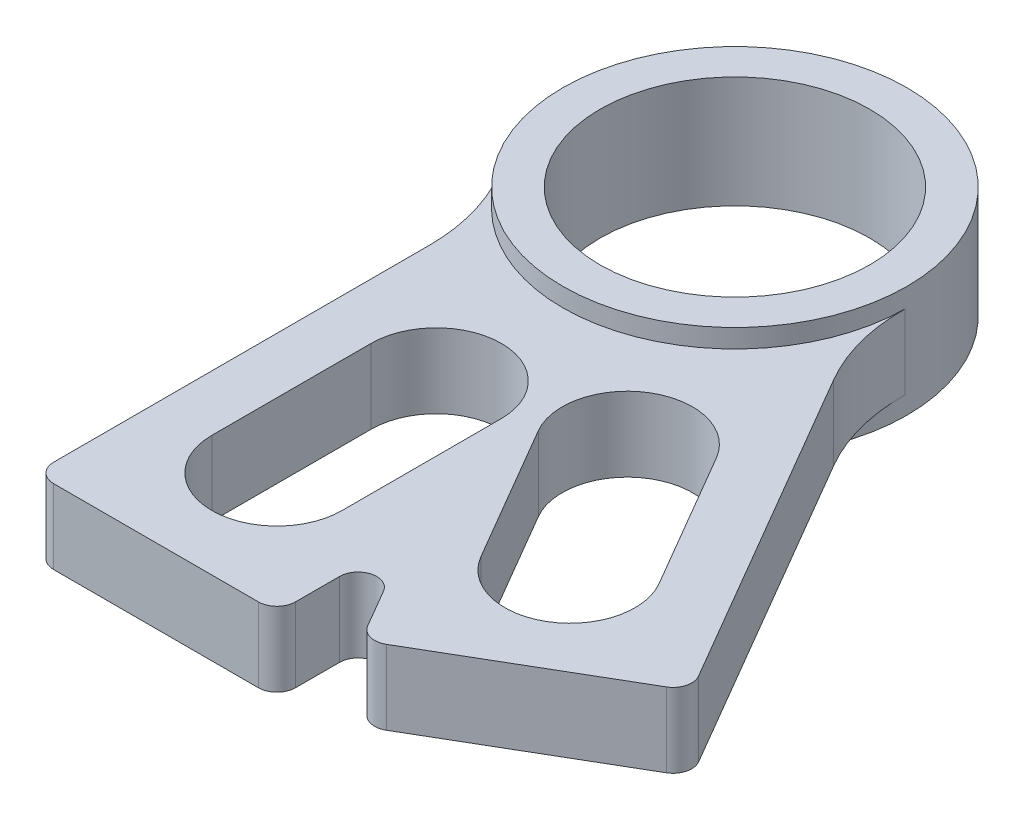
ISO-10303-21;
HEADER;
FILE_DESCRIPTION(('STEP AP214'),'2;1');
FILE_NAME('part.step','',(''),(''),'','','');
FILE_SCHEMA(('AUTOMOTIVE_DESIGN { 1 0 10303 214 1 1 1 1 }'));
ENDSEC;
DATA;
#1=APPLICATION_CONTEXT('core data for automotive mechanical design processes');
#2=APPLICATION_PROTOCOL_DEFINITION('international standard','automotive_design',2000,#1);
#3=PRODUCT_CONTEXT('',#1,'mechanical');
#4=PRODUCT('Part','Part','',(#3));
#5=PRODUCT_RELATED_PRODUCT_CATEGORY('part','',(#4));
#6=PRODUCT_DEFINITION_FORMATION('','',#4);
#7=PRODUCT_DEFINITION_CONTEXT('part definition',#1,'design');
#8=PRODUCT_DEFINITION('design','',#6,#7);
#9=PRODUCT_DEFINITION_SHAPE('','',#8);
#10=(LENGTH_UNIT() NAMED_UNIT(*) SI_UNIT(.MILLI.,.METRE.));
#11=(NAMED_UNIT(*) PLANE_ANGLE_UNIT() SI_UNIT($,.RADIAN.));
#12=(NAMED_UNIT(*) SI_UNIT($,.STERADIAN.) SOLID_ANGLE_UNIT());
#13=UNCERTAINTY_MEASURE_WITH_UNIT(LENGTH_MEASURE(1.E-05),#10,'distance_accuracy_value','');
#14=(GEOMETRIC_REPRESENTATION_CONTEXT(3) GLOBAL_UNCERTAINTY_ASSIGNED_CONTEXT((#13)) GLOBAL_UNIT_ASSIGNED_CONTEXT((#10,
#11,#12)) REPRESENTATION_CONTEXT('',''));
#15=CARTESIAN_POINT('',(0.,0.,0.));
#16=DIRECTION('',(0.,0.,1.));
#17=DIRECTION('',(1.,0.,0.));
#18=AXIS2_PLACEMENT_3D('',#15,#16,#17);
#19=CARTESIAN_POINT('',(0.,4.7625,0.));
#20=DIRECTION('',(0.,-1.,0.));
#21=DIRECTION('',(0.,0.,-1.));
#22=AXIS2_PLACEMENT_3D('',#19,#20,#21);
#23=CYLINDRICAL_SURFACE('',#22,11.5062);
#24=CARTESIAN_POINT('',(0.,4.7625,0.));
#25=DIRECTION('',(0.,1.,0.));
#26=DIRECTION('',(0.,0.,1.));
#27=AXIS2_PLACEMENT_3D('',#24,#25,#26);
#28=CIRCLE('',#27,11.5062);
#29=CARTESIAN_POINT('',(0.,4.7625,-11.5062));
#30=VERTEX_POINT('',#29);
#31=EDGE_CURVE('E299',#30,#30,#28,.T.);
#32=CARTESIAN_POINT('',(0.,-4.7625,0.));
#33=DIRECTION('',(0.,1.,0.));
#34=DIRECTION('',(0.,0.,1.));
#35=AXIS2_PLACEMENT_3D('',#32,#33,#34);
#36=CIRCLE('',#35,11.5062);
#37=CARTESIAN_POINT('',(0.,-4.7625,-11.5062));
#38=VERTEX_POINT('',#37);
#39=EDGE_CURVE('E294',#38,#38,#36,.T.);
#40=CARTESIAN_POINT('',(0.,4.7625,-11.5062));
#41=CARTESIAN_POINT('',(0.,4.66328125,-11.5062));
#42=CARTESIAN_POINT('',(0.,4.5640625,-11.5062));
#43=CARTESIAN_POINT('',(0.,4.365625,-11.5062));
#44=CARTESIAN_POINT('',(0.,4.26640625,-11.5062));
#45=CARTESIAN_POINT('',(0.,4.06796875,-11.5062));
#46=CARTESIAN_POINT('',(0.,3.96875,-11.5062));
#47=CARTESIAN_POINT('',(0.,3.7703125,-11.5062));
#48=CARTESIAN_POINT('',(0.,3.67109375,-11.5062));
#49=CARTESIAN_POINT('',(0.,3.47265625,-11.5062));
#50=CARTESIAN_POINT('',(0.,3.3734375,-11.5062));
#51=CARTESIAN_POINT('',(0.,3.175,-11.5062));
#52=CARTESIAN_POINT('',(0.,3.07578125,-11.5062));
#53=CARTESIAN_POINT('',(0.,2.87734375,-11.5062));
#54=CARTESIAN_POINT('',(0.,2.778125,-11.5062));
#55=CARTESIAN_POINT('',(0.,2.5796875,-11.5062));
#56=CARTESIAN_POINT('',(0.,2.48046875,-11.5062));
#57=CARTESIAN_POINT('',(0.,2.28203125,-11.5062));
#58=CARTESIAN_POINT('',(0.,2.1828125,-11.5062));
#59=CARTESIAN_POINT('',(0.,1.984375,-11.5062));
#60=CARTESIAN_POINT('',(0.,1.88515625,-11.5062));
#61=CARTESIAN_POINT('',(0.,1.68671875,-11.5062));
#62=CARTESIAN_POINT('',(0.,1.5875,-11.5062));
#63=CARTESIAN_POINT('',(0.,1.3890625,-11.5062));
#64=CARTESIAN_POINT('',(0.,1.28984375,-11.5062));
#65=CARTESIAN_POINT('',(0.,1.09140625,-11.5062));
#66=CARTESIAN_POINT('',(0.,0.992187499999999,-11.5062));
#67=CARTESIAN_POINT('',(0.,0.79375,-11.5062));
#68=CARTESIAN_POINT('',(0.,0.69453125,-11.5062));
#69=CARTESIAN_POINT('',(0.,0.49609375,-11.5062));
#70=CARTESIAN_POINT('',(0.,0.396875,-11.5062));
#71=CARTESIAN_POINT('',(0.,0.1984375,-11.5062));
#72=CARTESIAN_POINT('',(0.,0.0992187500000001,-11.5062));
#73=CARTESIAN_POINT('',(0.,-0.0992187500000001,-11.5062));
#74=CARTESIAN_POINT('',(0.,-0.1984375,-11.5062));
#75=CARTESIAN_POINT('',(0.,-0.396875,-11.5062));
#76=CARTESIAN_POINT('',(0.,-0.49609375,-11.5062));
#77=CARTESIAN_POINT('',(0.,-0.69453125,-11.5062));
#78=CARTESIAN_POINT('',(0.,-0.793750000000001,-11.5062));
#79=CARTESIAN_POINT('',(0.,-0.992187500000001,-11.5062));
#80=CARTESIAN_POINT('',(0.,-1.09140625,-11.5062));
#81=CARTESIAN_POINT('',(0.,-1.28984375,-11.5062));
#82=CARTESIAN_POINT('',(0.,-1.3890625,-11.5062));
#83=CARTESIAN_POINT('',(0.,-1.5875,-11.5062));
#84=CARTESIAN_POINT('',(0.,-1.68671875,-11.5062));
#85=CARTESIAN_POINT('',(0.,-1.88515625,-11.5062));
#86=CARTESIAN_POINT('',(0.,-1.984375,-11.5062));
#87=CARTESIAN_POINT('',(0.,-2.1828125,-11.5062));
#88=CARTESIAN_POINT('',(0.,-2.28203125,-11.5062));
#89=CARTESIAN_POINT('',(0.,-2.48046875,-11.5062));
#90=CARTESIAN_POINT('',(0.,-2.5796875,-11.5062));
#91=CARTESIAN_POINT('',(0.,-2.778125,-11.5062));
#92=CARTESIAN_POINT('',(0.,-2.87734375,-11.5062));
#93=CARTESIAN_POINT('',(0.,-3.07578125,-11.5062));
#94=CARTESIAN_POINT('',(0.,-3.175,-11.5062));
#95=CARTESIAN_POINT('',(0.,-3.3734375,-11.5062));
#96=CARTESIAN_POINT('',(0.,-3.47265625,-11.5062));
#97=CARTESIAN_POINT('',(0.,-3.67109375,-11.5062));
#98=CARTESIAN_POINT('',(0.,-3.7703125,-11.5062));
#99=CARTESIAN_POINT('',(0.,-3.96875,-11.5062));
#100=CARTESIAN_POINT('',(0.,-4.06796875,-11.5062));
#101=CARTESIAN_POINT('',(0.,-4.26640625,-11.5062));
#102=CARTESIAN_POINT('',(0.,-4.365625,-11.5062));
#103=CARTESIAN_POINT('',(0.,-4.5640625,-11.5062));
#104=CARTESIAN_POINT('',(0.,-4.66328125,-11.5062));
#105=CARTESIAN_POINT('',(0.,-4.7625,-11.5062));
#106=B_SPLINE_CURVE_WITH_KNOTS('',3,(#40,#41,#42,#43,#44,#45,#46,#47,#48,#49,#50,#51,#52,#53,
#54,#55,#56,#57,#58,#59,#60,#61,#62,#63,#64,#65,#66,#67,#68,#69,#70,#71,#72,#73,#74,#75,#76,#77,
#78,#79,#80,#81,#82,#83,#84,#85,#86,#87,#88,#89,#90,#91,#92,#93,#94,#95,#96,#97,#98,#99,#100,
#101,#102,#103,#104,#105),.UNSPECIFIED.,.F.,.F.,(4,2,2,2,2,2,2,2,2,2,2,2,2,2,2,2,2,2,2,2,2,2,2,
2,2,2,2,2,2,2,2,2,4),(0.,0.29765625,0.5953125,0.892968750000001,1.190625,1.48828125,1.7859375,
2.08359375,2.38125,2.67890625,2.9765625,3.27421875,3.571875,3.86953125,4.1671875,4.46484375,
4.7625,5.06015625,5.3578125,5.65546875,5.953125,6.25078125,6.5484375,6.84609375,7.14375,
7.44140625,7.7390625,8.03671875,8.334375,8.63203125,8.9296875,9.22734375,9.525),.UNSPECIFIED.);
#107=EDGE_CURVE('BSEAM41',#30,#38,#106,.T.);
#108=ORIENTED_EDGE('',*,*,#31,.T.);
#109=ORIENTED_EDGE('',*,*,#39,.F.);
#110=ORIENTED_EDGE('',*,*,#107,.T.);
#111=ORIENTED_EDGE('',*,*,#107,.F.);
#112=EDGE_LOOP('',(#108,#110,#109,#111));
#113=FACE_BOUND('',#112,.T.);
#114=ADVANCED_FACE('F41',(#113),#23,.F.);
#115=CARTESIAN_POINT('',(0.,4.7625,0.));
#116=DIRECTION('',(0.,-1.,0.));
#117=DIRECTION('',(0.,0.,-1.));
#118=AXIS2_PLACEMENT_3D('',#115,#116,#117);
#119=CYLINDRICAL_SURFACE('',#118,14.6812);
#120=DIRECTION('',(0.,-1.,0.));
#121=VECTOR('',#120,1.);
#122=CARTESIAN_POINT('',(14.6801691471723,4.7625,0.173974855687374));
#123=LINE('',#122,#121);
#124=CARTESIAN_POINT('',(14.6801691471723,3.175,0.173974855687374));
#125=VERTEX_POINT('',#124);
#126=CARTESIAN_POINT('',(14.6801691471723,-3.175,0.173974855687374));
#127=VERTEX_POINT('',#126);
#128=EDGE_CURVE('E313',#125,#127,#123,.T.);
#129=ORIENTED_EDGE('',*,*,#128,.T.);
#130=CARTESIAN_POINT('',(0.,-3.175,0.));
#131=DIRECTION('',(0.,1.,0.));
#132=DIRECTION('',(0.,0.,1.));
#133=AXIS2_PLACEMENT_3D('',#130,#131,#132);
#134=CIRCLE('',#133,14.6812);
#135=CARTESIAN_POINT('',(-12.5938687913907,-3.175,7.54533646070437));
#136=VERTEX_POINT('',#135);
#137=EDGE_CURVE('E270',#136,#127,#134,.T.);
#138=ORIENTED_EDGE('',*,*,#137,.F.);
#139=DIRECTION('',(0.,-1.,0.));
#140=VECTOR('',#139,1.);
#141=CARTESIAN_POINT('',(-12.5938687913907,4.7625,7.54533646070436));
#142=LINE('',#141,#140);
#143=CARTESIAN_POINT('',(-12.5938687913907,3.175,7.54533646070437));
#144=VERTEX_POINT('',#143);
#145=EDGE_CURVE('E306',#136,#144,#142,.F.);
#146=ORIENTED_EDGE('',*,*,#145,.T.);
#147=CARTESIAN_POINT('',(0.,3.175,0.));
#148=DIRECTION('',(0.,1.,0.));
#149=DIRECTION('',(0.,0.,1.));
#150=AXIS2_PLACEMENT_3D('',#147,#148,#149);
#151=CIRCLE('',#150,14.6812);
#152=EDGE_CURVE('E232',#144,#125,#151,.T.);
#153=ORIENTED_EDGE('',*,*,#152,.T.);
#154=EDGE_LOOP('',(#129,#138,#146,#153));
#155=FACE_BOUND('',#154,.T.);
#156=CARTESIAN_POINT('',(0.,4.7625,0.));
#157=DIRECTION('',(0.,1.,0.));
#158=DIRECTION('',(0.,0.,1.));
#159=AXIS2_PLACEMENT_3D('',#156,#157,#158);
#160=CIRCLE('',#159,14.6812);
#161=CARTESIAN_POINT('',(0.,4.7625,14.6812));
#162=VERTEX_POINT('',#161);
#163=EDGE_CURVE('E302',#162,#162,#160,.T.);
#164=ORIENTED_EDGE('',*,*,#163,.F.);
#165=EDGE_LOOP('',(#164));
#166=FACE_BOUND('',#165,.T.);
#167=CARTESIAN_POINT('',(0.,-4.7625,0.));
#168=DIRECTION('',(0.,1.,0.));
#169=DIRECTION('',(0.,0.,1.));
#170=AXIS2_PLACEMENT_3D('',#167,#168,#169);
#171=CIRCLE('',#170,14.6812);
#172=CARTESIAN_POINT('',(0.,-4.7625,14.6812));
#173=VERTEX_POINT('',#172);
#174=EDGE_CURVE('E303',#173,#173,#171,.T.);
#175=ORIENTED_EDGE('',*,*,#174,.T.);
#176=EDGE_LOOP('',(#175));
#177=FACE_BOUND('',#176,.T.);
#178=ADVANCED_FACE('F409',(#155,#166,#177),#119,.T.);
#179=CARTESIAN_POINT('',(0.,4.7625,0.));
#180=DIRECTION('',(0.,1.,0.));
#181=DIRECTION('',(0.,0.,1.));
#182=AXIS2_PLACEMENT_3D('',#179,#180,#181);
#183=PLANE('',#182);
#184=ORIENTED_EDGE('',*,*,#31,.F.);
#185=EDGE_LOOP('',(#184));
#186=FACE_BOUND('',#185,.T.);
#187=ORIENTED_EDGE('',*,*,#163,.T.);
#188=EDGE_LOOP('',(#187));
#189=FACE_BOUND('',#188,.T.);
#190=ADVANCED_FACE('F445',(#186,#189),#183,.T.);
#191=CARTESIAN_POINT('',(0.,-4.7625,0.));
#192=DIRECTION('',(0.,1.,0.));
#193=DIRECTION('',(0.,0.,1.));
#194=AXIS2_PLACEMENT_3D('',#191,#192,#193);
#195=PLANE('',#194);
#196=ORIENTED_EDGE('',*,*,#39,.T.);
#197=EDGE_LOOP('',(#196));
#198=FACE_BOUND('',#197,.T.);
#199=ORIENTED_EDGE('',*,*,#174,.F.);
#200=EDGE_LOOP('',(#199));
#201=FACE_BOUND('',#200,.T.);
#202=ADVANCED_FACE('F619',(#198,#201),#195,.F.);
#203=CARTESIAN_POINT('',(-10.31875,3.175,0.));
#204=DIRECTION('',(-1.,0.,0.));
#205=DIRECTION('',(0.,0.,1.));
#206=AXIS2_PLACEMENT_3D('',#203,#204,#205);
#207=PLANE('',#206);
#208=DIRECTION('',(0.,0.,-1.));
#209=VECTOR('',#208,1.);
#210=CARTESIAN_POINT('',(-10.31875,-3.175,0.));
#211=LINE('',#210,#209);
#212=CARTESIAN_POINT('',(-10.31875,-3.175,47.8028));
#213=VERTEX_POINT('',#212);
#214=CARTESIAN_POINT('',(-10.31875,-3.175,15.7694921185655));
#215=VERTEX_POINT('',#214);
#216=EDGE_CURVE('E272',#213,#215,#211,.T.);
#217=ORIENTED_EDGE('',*,*,#216,.F.);
#218=DIRECTION('',(0.,-1.,0.));
#219=VECTOR('',#218,1.);
#220=CARTESIAN_POINT('',(-10.31875,3.175,47.8028));
#221=LINE('',#220,#219);
#222=CARTESIAN_POINT('',(-10.31875,3.175,47.8028));
#223=VERTEX_POINT('',#222);
#224=EDGE_CURVE('E372',#213,#223,#221,.F.);
#225=ORIENTED_EDGE('',*,*,#224,.T.);
#226=DIRECTION('',(0.,0.,-1.));
#227=VECTOR('',#226,1.);
#228=CARTESIAN_POINT('',(-10.31875,3.175,0.));
#229=LINE('',#228,#227);
#230=CARTESIAN_POINT('',(-10.31875,3.175,15.7694921185655));
#231=VERTEX_POINT('',#230);
#232=EDGE_CURVE('E234',#223,#231,#229,.T.);
#233=ORIENTED_EDGE('',*,*,#232,.T.);
#234=DIRECTION('',(0.,-1.,0.));
#235=VECTOR('',#234,1.);
#236=CARTESIAN_POINT('',(-10.31875,3.175,15.7694921185655));
#237=LINE('',#236,#235);
#238=EDGE_CURVE('E319',#231,#215,#237,.T.);
#239=ORIENTED_EDGE('',*,*,#238,.T.);
#240=EDGE_LOOP('',(#217,#225,#233,#239));
#241=FACE_BOUND('',#240,.T.);
#242=ADVANCED_FACE('F611',(#241),#207,.T.);
#243=CARTESIAN_POINT('',(0.,3.175,49.3903));
#244=DIRECTION('',(0.,0.,-1.));
#245=DIRECTION('',(-1.,0.,0.));
#246=AXIS2_PLACEMENT_3D('',#243,#244,#245);
#247=PLANE('',#246);
#248=DIRECTION('',(1.,0.,0.));
#249=VECTOR('',#248,1.);
#250=CARTESIAN_POINT('',(0.,-3.175,49.3903));
#251=LINE('',#250,#249);
#252=CARTESIAN_POINT('',(-8.73124999999999,-3.175,49.3903));
#253=VERTEX_POINT('',#252);
#254=CARTESIAN_POINT('',(8.73125,-3.175,49.3903));
#255=VERTEX_POINT('',#254);
#256=EDGE_CURVE('E274',#253,#255,#251,.T.);
#257=ORIENTED_EDGE('',*,*,#256,.T.);
#258=DIRECTION('',(0.,-1.,0.));
#259=VECTOR('',#258,1.);
#260=CARTESIAN_POINT('',(8.73125,3.175,49.3903));
#261=LINE('',#260,#259);
#262=CARTESIAN_POINT('',(8.73125,3.175,49.3903));
#263=VERTEX_POINT('',#262);
#264=EDGE_CURVE('E370',#255,#263,#261,.F.);
#265=ORIENTED_EDGE('',*,*,#264,.T.);
#266=DIRECTION('',(1.,0.,0.));
#267=VECTOR('',#266,1.);
#268=CARTESIAN_POINT('',(0.,3.175,49.3903));
#269=LINE('',#268,#267);
#270=CARTESIAN_POINT('',(-8.73124999999999,3.175,49.3903));
#271=VERTEX_POINT('',#270);
#272=EDGE_CURVE('E236',#271,#263,#269,.T.);
#273=ORIENTED_EDGE('',*,*,#272,.F.);
#274=DIRECTION('',(0.,-1.,0.));
#275=VECTOR('',#274,1.);
#276=CARTESIAN_POINT('',(-8.73124999999999,-3.175,49.3903));
#277=LINE('',#276,#275);
#278=EDGE_CURVE('E367',#271,#253,#277,.T.);
#279=ORIENTED_EDGE('',*,*,#278,.T.);
#280=EDGE_LOOP('',(#257,#265,#273,#279));
#281=FACE_BOUND('',#280,.T.);
#282=ADVANCED_FACE('F426',(#281),#247,.F.);
#283=CARTESIAN_POINT('',(10.31875,3.175,0.));
#284=DIRECTION('',(-1.,0.,0.));
#285=DIRECTION('',(0.,0.,1.));
#286=AXIS2_PLACEMENT_3D('',#283,#284,#285);
#287=PLANE('',#286);
#288=DIRECTION('',(0.,0.,-1.));
#289=VECTOR('',#288,1.);
#290=CARTESIAN_POINT('',(10.31875,-3.175,0.));
#291=LINE('',#290,#289);
#292=CARTESIAN_POINT('',(10.31875,-3.175,47.8028));
#293=VERTEX_POINT('',#292);
#294=CARTESIAN_POINT('',(10.31875,-3.175,44.053125));
#295=VERTEX_POINT('',#294);
#296=EDGE_CURVE('E277',#293,#295,#291,.T.);
#297=ORIENTED_EDGE('',*,*,#296,.T.);
#298=DIRECTION('',(0.,-1.,0.));
#299=VECTOR('',#298,1.);
#300=CARTESIAN_POINT('',(10.31875,3.175,44.053125));
#301=LINE('',#300,#299);
#302=CARTESIAN_POINT('',(10.31875,3.175,44.053125));
#303=VERTEX_POINT('',#302);
#304=EDGE_CURVE('E365',#295,#303,#301,.F.);
#305=ORIENTED_EDGE('',*,*,#304,.T.);
#306=DIRECTION('',(0.,0.,-1.));
#307=VECTOR('',#306,1.);
#308=CARTESIAN_POINT('',(10.31875,3.175,0.));
#309=LINE('',#308,#307);
#310=CARTESIAN_POINT('',(10.31875,3.175,47.8028));
#311=VERTEX_POINT('',#310);
#312=EDGE_CURVE('E239',#311,#303,#309,.T.);
#313=ORIENTED_EDGE('',*,*,#312,.F.);
#314=DIRECTION('',(0.,-1.,0.));
#315=VECTOR('',#314,1.);
#316=CARTESIAN_POINT('',(10.31875,3.175,47.8028));
#317=LINE('',#316,#315);
#318=EDGE_CURVE('E362',#311,#293,#317,.T.);
#319=ORIENTED_EDGE('',*,*,#318,.T.);
#320=EDGE_LOOP('',(#297,#305,#313,#319));
#321=FACE_BOUND('',#320,.T.);
#322=ADVANCED_FACE('F381',(#321),#287,.F.);
#323=CARTESIAN_POINT('',(-8.91388274336287,3.175,5.19800884955756));
#324=DIRECTION('',(-0.863852961198093,0.,0.503744043567053));
#325=DIRECTION('',(0.503744043567053,0.,0.863852961198093));
#326=AXIS2_PLACEMENT_3D('',#323,#324,#325);
#327=PLANE('',#326);
#328=DIRECTION('',(-0.503744043567053,0.,-0.863852961198093));
#329=VECTOR('',#328,1.);
#330=CARTESIAN_POINT('',(-8.91388274336287,-3.175,5.19800884955756));
#331=LINE('',#330,#329);
#332=CARTESIAN_POINT('',(15.1664930224643,-3.175,46.4925991831178));
#333=VERTEX_POINT('',#332);
#334=CARTESIAN_POINT('',(13.277616575902,-3.175,43.2534313308373));
#335=VERTEX_POINT('',#334);
#336=EDGE_CURVE('E280',#333,#335,#331,.T.);
#337=ORIENTED_EDGE('',*,*,#336,.F.);
#338=DIRECTION('',(0.,-1.,0.));
#339=VECTOR('',#338,1.);
#340=CARTESIAN_POINT('',(15.1664930224643,3.175,46.4925991831178));
#341=LINE('',#340,#339);
#342=CARTESIAN_POINT('',(15.1664930224643,3.175,46.4925991831178));
#343=VERTEX_POINT('',#342);
#344=EDGE_CURVE('E61',#333,#343,#341,.F.);
#345=ORIENTED_EDGE('',*,*,#344,.T.);
#346=DIRECTION('',(-0.503744043567053,0.,-0.863852961198093));
#347=VECTOR('',#346,1.);
#348=CARTESIAN_POINT('',(-8.91388274336287,3.175,5.19800884955756));
#349=LINE('',#348,#347);
#350=CARTESIAN_POINT('',(13.277616575902,3.175,43.2534313308373));
#351=VERTEX_POINT('',#350);
#352=EDGE_CURVE('E241',#343,#351,#349,.T.);
#353=ORIENTED_EDGE('',*,*,#352,.T.);
#354=DIRECTION('',(0.,-1.,0.));
#355=VECTOR('',#354,1.);
#356=CARTESIAN_POINT('',(13.277616575902,3.175,43.2534313308373));
#357=LINE('',#356,#355);
#358=EDGE_CURVE('E358',#351,#335,#357,.T.);
#359=ORIENTED_EDGE('',*,*,#358,.T.);
#360=EDGE_LOOP('',(#337,#345,#353,#359));
#361=FACE_BOUND('',#360,.T.);
#362=ADVANCED_FACE('F385',(#361),#327,.T.);
#363=CARTESIAN_POINT('',(24.8800694349898,3.175,42.6659569094622));
#364=DIRECTION('',(-0.503744043567053,0.,-0.863852961198093));
#365=DIRECTION('',(-0.863852961198093,0.,0.503744043567053));
#366=AXIS2_PLACEMENT_3D('',#363,#364,#365);
#367=PLANE('',#366);
#368=DIRECTION('',(0.863852961198093,0.,-0.503744043567053));
#369=VECTOR('',#368,1.);
#370=CARTESIAN_POINT('',(24.8800694349898,-3.175,42.6659569094622));
#371=LINE('',#370,#369);
#372=CARTESIAN_POINT('',(17.337553267529,-3.175,47.0642720898571));
#373=VERTEX_POINT('',#372);
#374=CARTESIAN_POINT('',(32.4225856024507,-3.175,38.2676417290674));
#375=VERTEX_POINT('',#374);
#376=EDGE_CURVE('E283',#373,#375,#371,.T.);
#377=ORIENTED_EDGE('',*,*,#376,.T.);
#378=DIRECTION('',(0.,-1.,0.));
#379=VECTOR('',#378,1.);
#380=CARTESIAN_POINT('',(32.4225856024507,3.175,38.2676417290674));
#381=LINE('',#380,#379);
#382=CARTESIAN_POINT('',(32.4225856024507,3.175,38.2676417290674));
#383=VERTEX_POINT('',#382);
#384=EDGE_CURVE('E348',#375,#383,#381,.F.);
#385=ORIENTED_EDGE('',*,*,#384,.T.);
#386=DIRECTION('',(0.863852961198093,0.,-0.503744043567053));
#387=VECTOR('',#386,1.);
#388=CARTESIAN_POINT('',(24.8800694349898,3.175,42.6659569094622));
#389=LINE('',#388,#387);
#390=CARTESIAN_POINT('',(17.337553267529,3.175,47.0642720898571));
#391=VERTEX_POINT('',#390);
#392=EDGE_CURVE('E243',#391,#383,#389,.T.);
#393=ORIENTED_EDGE('',*,*,#392,.F.);
#394=DIRECTION('',(0.,-1.,0.));
#395=VECTOR('',#394,1.);
#396=CARTESIAN_POINT('',(17.337553267529,-3.175,47.0642720898571));
#397=LINE('',#396,#395);
#398=EDGE_CURVE('E345',#391,#373,#397,.T.);
#399=ORIENTED_EDGE('',*,*,#398,.T.);
#400=EDGE_LOOP('',(#377,#385,#393,#399));
#401=FACE_BOUND('',#400,.T.);
#402=ADVANCED_FACE('F393',(#401),#367,.F.);
#403=CARTESIAN_POINT('',(0.,3.175,25.48255));
#404=DIRECTION('',(0.,-1.,0.));
#405=DIRECTION('',(0.,0.,-1.));
#406=AXIS2_PLACEMENT_3D('',#403,#404,#405);
#407=CYLINDRICAL_SURFACE('',#406,5.55625);
#408=CARTESIAN_POINT('',(0.,-3.175,25.48255));
#409=DIRECTION('',(0.,1.,0.));
#410=DIRECTION('',(0.,0.,1.));
#411=AXIS2_PLACEMENT_3D('',#408,#409,#410);
#412=CIRCLE('',#411,5.55625);
#413=CARTESIAN_POINT('',(5.55625,-3.175,25.48255));
#414=VERTEX_POINT('',#413);
#415=CARTESIAN_POINT('',(-5.55624999999999,-3.175,25.48255));
#416=VERTEX_POINT('',#415);
#417=EDGE_CURVE('E258',#414,#416,#412,.T.);
#418=ORIENTED_EDGE('',*,*,#417,.F.);
#419=DIRECTION('',(0.,-1.,0.));
#420=VECTOR('',#419,1.);
#421=CARTESIAN_POINT('',(5.55625,3.175,25.48255));
#422=LINE('',#421,#420);
#423=CARTESIAN_POINT('',(5.55625,3.175,25.48255));
#424=VERTEX_POINT('',#423);
#425=EDGE_CURVE('E292',#424,#414,#422,.T.);
#426=ORIENTED_EDGE('',*,*,#425,.F.);
#427=CARTESIAN_POINT('',(0.,3.175,25.48255));
#428=DIRECTION('',(0.,1.,0.));
#429=DIRECTION('',(0.,0.,1.));
#430=AXIS2_PLACEMENT_3D('',#427,#428,#429);
#431=CIRCLE('',#430,5.55625);
#432=CARTESIAN_POINT('',(-5.55624999999999,3.175,25.48255));
#433=VERTEX_POINT('',#432);
#434=EDGE_CURVE('E221',#424,#433,#431,.T.);
#435=ORIENTED_EDGE('',*,*,#434,.T.);
#436=DIRECTION('',(0.,-1.,0.));
#437=VECTOR('',#436,1.);
#438=CARTESIAN_POINT('',(-5.55624999999999,3.175,25.48255));
#439=LINE('',#438,#437);
#440=EDGE_CURVE('E200',#433,#416,#439,.T.);
#441=ORIENTED_EDGE('',*,*,#440,.T.);
#442=EDGE_LOOP('',(#418,#426,#435,#441));
#443=FACE_BOUND('',#442,.T.);
#444=ADVANCED_FACE('F573',(#443),#407,.F.);
#445=CARTESIAN_POINT('',(5.55625,3.175,0.));
#446=DIRECTION('',(-1.,0.,0.));
#447=DIRECTION('',(0.,0.,1.));
#448=AXIS2_PLACEMENT_3D('',#445,#446,#447);
#449=PLANE('',#448);
#450=DIRECTION('',(0.,0.,-1.));
#451=VECTOR('',#450,1.);
#452=CARTESIAN_POINT('',(5.55625,-3.175,0.));
#453=LINE('',#452,#451);
#454=CARTESIAN_POINT('',(5.55625,-3.175,39.07155));
#455=VERTEX_POINT('',#454);
#456=EDGE_CURVE('E261',#455,#414,#453,.T.);
#457=ORIENTED_EDGE('',*,*,#456,.F.);
#458=DIRECTION('',(0.,-1.,0.));
#459=VECTOR('',#458,1.);
#460=CARTESIAN_POINT('',(5.55625,3.175,39.07155));
#461=LINE('',#460,#459);
#462=CARTESIAN_POINT('',(5.55625,3.175,39.07155));
#463=VERTEX_POINT('',#462);
#464=EDGE_CURVE('E290',#463,#455,#461,.T.);
#465=ORIENTED_EDGE('',*,*,#464,.F.);
#466=DIRECTION('',(0.,0.,-1.));
#467=VECTOR('',#466,1.);
#468=CARTESIAN_POINT('',(5.55625,3.175,0.));
#469=LINE('',#468,#467);
#470=EDGE_CURVE('E224',#463,#424,#469,.T.);
#471=ORIENTED_EDGE('',*,*,#470,.T.);
#472=ORIENTED_EDGE('',*,*,#425,.T.);
#473=EDGE_LOOP('',(#457,#465,#471,#472));
#474=FACE_BOUND('',#473,.T.);
#475=ADVANCED_FACE('F564',(#474),#449,.T.);
#476=CARTESIAN_POINT('',(0.,3.175,39.07155));
#477=DIRECTION('',(0.,-1.,0.));
#478=DIRECTION('',(0.,0.,-1.));
#479=AXIS2_PLACEMENT_3D('',#476,#477,#478);
#480=CYLINDRICAL_SURFACE('',#479,5.55625);
#481=CARTESIAN_POINT('',(0.,-3.175,39.07155));
#482=DIRECTION('',(0.,1.,0.));
#483=DIRECTION('',(0.,0.,1.));
#484=AXIS2_PLACEMENT_3D('',#481,#482,#483);
#485=CIRCLE('',#484,5.55625);
#486=CARTESIAN_POINT('',(-5.55625,-3.175,39.07155));
#487=VERTEX_POINT('',#486);
#488=EDGE_CURVE('E264',#487,#455,#485,.T.);
#489=ORIENTED_EDGE('',*,*,#488,.F.);
#490=DIRECTION('',(0.,-1.,0.));
#491=VECTOR('',#490,1.);
#492=CARTESIAN_POINT('',(-5.55625,3.175,39.07155));
#493=LINE('',#492,#491);
#494=CARTESIAN_POINT('',(-5.55625,3.175,39.07155));
#495=VERTEX_POINT('',#494);
#496=EDGE_CURVE('E288',#495,#487,#493,.T.);
#497=ORIENTED_EDGE('',*,*,#496,.F.);
#498=CARTESIAN_POINT('',(0.,3.175,39.07155));
#499=DIRECTION('',(0.,1.,0.));
#500=DIRECTION('',(0.,0.,1.));
#501=AXIS2_PLACEMENT_3D('',#498,#499,#500);
#502=CIRCLE('',#501,5.55625);
#503=EDGE_CURVE('E227',#495,#463,#502,.T.);
#504=ORIENTED_EDGE('',*,*,#503,.T.);
#505=ORIENTED_EDGE('',*,*,#464,.T.);
#506=EDGE_LOOP('',(#489,#497,#504,#505));
#507=FACE_BOUND('',#506,.T.);
#508=ADVANCED_FACE('F556',(#507),#480,.F.);
#509=CARTESIAN_POINT('',(12.8366827773996,3.175,22.0131762763785));
#510=DIRECTION('',(0.,-1.,0.));
#511=DIRECTION('',(0.,0.,-1.));
#512=AXIS2_PLACEMENT_3D('',#509,#510,#511);
#513=CYLINDRICAL_SURFACE('',#512,5.55625000000001);
#514=CARTESIAN_POINT('',(12.8366827773996,-3.175,22.0131762763785));
#515=DIRECTION('',(0.,1.,0.));
#516=DIRECTION('',(0.,0.,1.));
#517=AXIS2_PLACEMENT_3D('',#514,#515,#516);
#518=CIRCLE('',#517,5.55625000000001);
#519=CARTESIAN_POINT('',(17.6364657930565,-3.175,19.2142484343091));
#520=VERTEX_POINT('',#519);
#521=CARTESIAN_POINT('',(8.03689976174268,-3.175,24.812104118448));
#522=VERTEX_POINT('',#521);
#523=EDGE_CURVE('E195',#520,#522,#518,.T.);
#524=ORIENTED_EDGE('',*,*,#523,.F.);
#525=DIRECTION('',(0.,-1.,0.));
#526=VECTOR('',#525,1.);
#527=CARTESIAN_POINT('',(17.6364657930565,3.175,19.2142484343091));
#528=LINE('',#527,#526);
#529=CARTESIAN_POINT('',(17.6364657930565,3.175,19.2142484343091));
#530=VERTEX_POINT('',#529);
#531=EDGE_CURVE('E190',#530,#520,#528,.T.);
#532=ORIENTED_EDGE('',*,*,#531,.F.);
#533=CARTESIAN_POINT('',(12.8366827773996,3.175,22.0131762763785));
#534=DIRECTION('',(0.,1.,0.));
#535=DIRECTION('',(0.,0.,1.));
#536=AXIS2_PLACEMENT_3D('',#533,#534,#535);
#537=CIRCLE('',#536,5.55625000000001);
#538=CARTESIAN_POINT('',(8.03689976174268,3.175,24.812104118448));
#539=VERTEX_POINT('',#538);
#540=EDGE_CURVE('E193',#530,#539,#537,.T.);
#541=ORIENTED_EDGE('',*,*,#540,.T.);
#542=DIRECTION('',(0.,-1.,0.));
#543=VECTOR('',#542,1.);
#544=CARTESIAN_POINT('',(8.03689976174268,3.175,24.812104118448));
#545=LINE('',#544,#543);
#546=EDGE_CURVE('E248',#539,#522,#545,.T.);
#547=ORIENTED_EDGE('',*,*,#546,.T.);
#548=EDGE_LOOP('',(#524,#532,#541,#547));
#549=FACE_BOUND('',#548,.T.);
#550=ADVANCED_FACE('F192',(#549),#513,.F.);
#551=CARTESIAN_POINT('',(4.79978301565689,3.175,-2.79892784206943));
#552=DIRECTION('',(-0.863852961198094,0.,0.503744043567053));
#553=DIRECTION('',(0.503744043567053,0.,0.863852961198094));
#554=AXIS2_PLACEMENT_3D('',#551,#552,#553);
#555=PLANE('',#554);
#556=DIRECTION('',(-0.503744043567053,0.,-0.863852961198094));
#557=VECTOR('',#556,1.);
#558=CARTESIAN_POINT('',(4.79978301565689,-3.175,-2.79892784206943));
#559=LINE('',#558,#557);
#560=CARTESIAN_POINT('',(24.4818436010892,-3.175,30.95314632403));
#561=VERTEX_POINT('',#560);
#562=EDGE_CURVE('E250',#561,#520,#559,.T.);
#563=ORIENTED_EDGE('',*,*,#562,.F.);
#564=DIRECTION('',(0.,-1.,0.));
#565=VECTOR('',#564,1.);
#566=CARTESIAN_POINT('',(24.4818436010892,3.175,30.95314632403));
#567=LINE('',#566,#565);
#568=CARTESIAN_POINT('',(24.4818436010892,3.175,30.95314632403));
#569=VERTEX_POINT('',#568);
#570=EDGE_CURVE('E201',#569,#561,#567,.T.);
#571=ORIENTED_EDGE('',*,*,#570,.F.);
#572=DIRECTION('',(-0.503744043567053,0.,-0.863852961198094));
#573=VECTOR('',#572,1.);
#574=CARTESIAN_POINT('',(4.79978301565689,3.175,-2.79892784206943));
#575=LINE('',#574,#573);
#576=EDGE_CURVE('E208',#569,#530,#575,.T.);
#577=ORIENTED_EDGE('',*,*,#576,.T.);
#578=ORIENTED_EDGE('',*,*,#531,.T.);
#579=EDGE_LOOP('',(#563,#571,#577,#578));
#580=FACE_BOUND('',#579,.T.);
#581=ADVANCED_FACE('F215',(#580),#555,.T.);
#582=CARTESIAN_POINT('',(19.6820605854323,3.175,33.7520741660994));
#583=DIRECTION('',(0.,-1.,0.));
#584=DIRECTION('',(0.,0.,-1.));
#585=AXIS2_PLACEMENT_3D('',#582,#583,#584);
#586=CYLINDRICAL_SURFACE('',#585,5.55625);
#587=CARTESIAN_POINT('',(19.6820605854323,-3.175,33.7520741660994));
#588=DIRECTION('',(0.,1.,0.));
#589=DIRECTION('',(0.,0.,1.));
#590=AXIS2_PLACEMENT_3D('',#587,#588,#589);
#591=CIRCLE('',#590,5.55625);
#592=CARTESIAN_POINT('',(14.8822775697754,-3.175,36.5510020081689));
#593=VERTEX_POINT('',#592);
#594=EDGE_CURVE('E252',#593,#561,#591,.T.);
#595=ORIENTED_EDGE('',*,*,#594,.F.);
#596=DIRECTION('',(0.,-1.,0.));
#597=VECTOR('',#596,1.);
#598=CARTESIAN_POINT('',(14.8822775697754,3.175,36.5510020081689));
#599=LINE('',#598,#597);
#600=CARTESIAN_POINT('',(14.8822775697754,3.175,36.5510020081689));
#601=VERTEX_POINT('',#600);
#602=EDGE_CURVE('E296',#601,#593,#599,.T.);
#603=ORIENTED_EDGE('',*,*,#602,.F.);
#604=CARTESIAN_POINT('',(19.6820605854323,3.175,33.7520741660994));
#605=DIRECTION('',(0.,1.,0.));
#606=DIRECTION('',(0.,0.,1.));
#607=AXIS2_PLACEMENT_3D('',#604,#605,#606);
#608=CIRCLE('',#607,5.55625);
#609=EDGE_CURVE('E216',#601,#569,#608,.T.);
#610=ORIENTED_EDGE('',*,*,#609,.T.);
#611=ORIENTED_EDGE('',*,*,#570,.T.);
#612=EDGE_LOOP('',(#595,#603,#610,#611));
#613=FACE_BOUND('',#612,.T.);
#614=ADVANCED_FACE('F532',(#613),#586,.F.);
#615=CARTESIAN_POINT('',(-5.55624999999999,3.175,0.));
#616=DIRECTION('',(-1.,0.,0.));
#617=DIRECTION('',(0.,0.,1.));
#618=AXIS2_PLACEMENT_3D('',#615,#616,#617);
#619=PLANE('',#618);
#620=DIRECTION('',(0.,0.,-1.));
#621=VECTOR('',#620,1.);
#622=CARTESIAN_POINT('',(-5.55624999999999,-3.175,0.));
#623=LINE('',#622,#621);
#624=EDGE_CURVE('E267',#487,#416,#623,.T.);
#625=ORIENTED_EDGE('',*,*,#624,.T.);
#626=ORIENTED_EDGE('',*,*,#440,.F.);
#627=DIRECTION('',(0.,0.,-1.));
#628=VECTOR('',#627,1.);
#629=CARTESIAN_POINT('',(-5.55624999999999,3.175,0.));
#630=LINE('',#629,#628);
#631=EDGE_CURVE('E230',#495,#433,#630,.T.);
#632=ORIENTED_EDGE('',*,*,#631,.F.);
#633=ORIENTED_EDGE('',*,*,#496,.T.);
#634=EDGE_LOOP('',(#625,#626,#632,#633));
#635=FACE_BOUND('',#634,.T.);
#636=ADVANCED_FACE('F523',(#635),#619,.F.);
#637=CARTESIAN_POINT('',(-4.79978301565695,3.175,2.79892784206947));
#638=DIRECTION('',(-0.863852961198093,0.,0.503744043567054));
#639=DIRECTION('',(0.503744043567054,0.,0.863852961198093));
#640=AXIS2_PLACEMENT_3D('',#637,#638,#639);
#641=PLANE('',#640);
#642=DIRECTION('',(-0.503744043567054,0.,-0.863852961198093));
#643=VECTOR('',#642,1.);
#644=CARTESIAN_POINT('',(-4.79978301565695,-3.175,2.79892784206947));
#645=LINE('',#644,#643);
#646=EDGE_CURVE('E255',#593,#522,#645,.T.);
#647=ORIENTED_EDGE('',*,*,#646,.T.);
#648=ORIENTED_EDGE('',*,*,#546,.F.);
#649=DIRECTION('',(-0.503744043567054,0.,-0.863852961198093));
#650=VECTOR('',#649,1.);
#651=CARTESIAN_POINT('',(-4.79978301565695,3.175,2.79892784206947));
#652=LINE('',#651,#650);
#653=EDGE_CURVE('E211',#601,#539,#652,.T.);
#654=ORIENTED_EDGE('',*,*,#653,.F.);
#655=ORIENTED_EDGE('',*,*,#602,.T.);
#656=EDGE_LOOP('',(#647,#648,#654,#655));
#657=FACE_BOUND('',#656,.T.);
#658=ADVANCED_FACE('F515',(#657),#641,.F.);
#659=CARTESIAN_POINT('',(8.91388274336278,3.175,-5.19800884955751));
#660=DIRECTION('',(-0.863852961198093,0.,0.503744043567053));
#661=DIRECTION('',(0.503744043567054,0.,0.863852961198093));
#662=AXIS2_PLACEMENT_3D('',#659,#660,#661);
#663=PLANE('',#662);
#664=DIRECTION('',(-0.503744043567054,0.,-0.863852961198093));
#665=VECTOR('',#664,1.);
#666=CARTESIAN_POINT('',(8.91388274336278,3.175,-5.19800884955751));
#667=LINE('',#666,#665);
#668=CARTESIAN_POINT('',(32.9942585091899,3.175,36.0965814840027));
#669=VERTEX_POINT('',#668);
#670=CARTESIAN_POINT('',(16.8576704681678,3.175,8.4245136136554));
#671=VERTEX_POINT('',#670);
#672=EDGE_CURVE('E246',#669,#671,#667,.T.);
#673=ORIENTED_EDGE('',*,*,#672,.F.);
#674=DIRECTION('',(0.,-1.,0.));
#675=VECTOR('',#674,1.);
#676=CARTESIAN_POINT('',(32.9942585091899,3.175,36.0965814840027));
#677=LINE('',#676,#675);
#678=CARTESIAN_POINT('',(32.9942585091899,-3.175,36.0965814840027));
#679=VERTEX_POINT('',#678);
#680=EDGE_CURVE('E334',#669,#679,#677,.T.);
#681=ORIENTED_EDGE('',*,*,#680,.T.);
#682=DIRECTION('',(-0.503744043567054,0.,-0.863852961198093));
#683=VECTOR('',#682,1.);
#684=CARTESIAN_POINT('',(8.91388274336278,-3.175,-5.19800884955751));
#685=LINE('',#684,#683);
#686=CARTESIAN_POINT('',(16.8576704681678,-3.175,8.4245136136554));
#687=VERTEX_POINT('',#686);
#688=EDGE_CURVE('E213',#679,#687,#685,.T.);
#689=ORIENTED_EDGE('',*,*,#688,.T.);
#690=DIRECTION('',(0.,1.,0.));
#691=VECTOR('',#690,1.);
#692=CARTESIAN_POINT('',(16.8576704681678,3.175,8.4245136136554));
#693=LINE('',#692,#691);
#694=EDGE_CURVE('E316',#687,#671,#693,.T.);
#695=ORIENTED_EDGE('',*,*,#694,.T.);
#696=EDGE_LOOP('',(#673,#681,#689,#695));
#697=FACE_BOUND('',#696,.T.);
#698=ADVANCED_FACE('F401',(#697),#663,.F.);
#699=CARTESIAN_POINT('',(0.,3.175,0.));
#700=DIRECTION('',(0.,1.,0.));
#701=DIRECTION('',(0.,0.,1.));
#702=AXIS2_PLACEMENT_3D('',#699,#700,#701);
#703=PLANE('',#702);
#704=ORIENTED_EDGE('',*,*,#540,.F.);
#705=ORIENTED_EDGE('',*,*,#576,.F.);
#706=ORIENTED_EDGE('',*,*,#609,.F.);
#707=ORIENTED_EDGE('',*,*,#653,.T.);
#708=EDGE_LOOP('',(#704,#705,#706,#707));
#709=FACE_BOUND('',#708,.T.);
#710=ORIENTED_EDGE('',*,*,#434,.F.);
#711=ORIENTED_EDGE('',*,*,#470,.F.);
#712=ORIENTED_EDGE('',*,*,#503,.F.);
#713=ORIENTED_EDGE('',*,*,#631,.T.);
#714=EDGE_LOOP('',(#710,#711,#712,#713));
#715=FACE_BOUND('',#714,.T.);
#716=ORIENTED_EDGE('',*,*,#392,.T.);
#717=CARTESIAN_POINT('',(31.622891933288,3.175,36.8962751531654));
#718=DIRECTION('',(0.,1.,0.));
#719=DIRECTION('',(0.,0.,1.));
#720=AXIS2_PLACEMENT_3D('',#717,#718,#719);
#721=CIRCLE('',#720,1.5875);
#722=EDGE_CURVE('E356',#383,#669,#721,.T.);
#723=ORIENTED_EDGE('',*,*,#722,.T.);
#724=ORIENTED_EDGE('',*,*,#672,.T.);
#725=CARTESIAN_POINT('',(30.6810455532597,3.175,0.363601428495411));
#726=DIRECTION('',(0.,1.,0.));
#727=DIRECTION('',(0.,0.,1.));
#728=AXIS2_PLACEMENT_3D('',#725,#726,#727);
#729=CIRCLE('',#728,16.002);
#730=EDGE_CURVE('E325',#671,#125,#729,.F.);
#731=ORIENTED_EDGE('',*,*,#730,.T.);
#732=ORIENTED_EDGE('',*,*,#152,.F.);
#733=CARTESIAN_POINT('',(-26.32075,3.175,15.7694921185655));
#734=DIRECTION('',(0.,1.,0.));
#735=DIRECTION('',(0.,0.,1.));
#736=AXIS2_PLACEMENT_3D('',#733,#734,#735);
#737=CIRCLE('',#736,16.002);
#738=EDGE_CURVE('E331',#144,#231,#737,.F.);
#739=ORIENTED_EDGE('',*,*,#738,.T.);
#740=ORIENTED_EDGE('',*,*,#232,.F.);
#741=CARTESIAN_POINT('',(-8.73124999999999,3.175,47.8028));
#742=DIRECTION('',(0.,1.,0.));
#743=DIRECTION('',(0.,0.,1.));
#744=AXIS2_PLACEMENT_3D('',#741,#742,#743);
#745=CIRCLE('',#744,1.5875);
#746=EDGE_CURVE('E350',#223,#271,#745,.T.);
#747=ORIENTED_EDGE('',*,*,#746,.T.);
#748=ORIENTED_EDGE('',*,*,#272,.T.);
#749=CARTESIAN_POINT('',(8.73125,3.175,47.8028));
#750=DIRECTION('',(0.,1.,0.));
#751=DIRECTION('',(0.,0.,1.));
#752=AXIS2_PLACEMENT_3D('',#749,#750,#751);
#753=CIRCLE('',#752,1.5875);
#754=EDGE_CURVE('E352',#263,#311,#753,.T.);
#755=ORIENTED_EDGE('',*,*,#754,.T.);
#756=ORIENTED_EDGE('',*,*,#312,.T.);
#757=CARTESIAN_POINT('',(11.90625,3.175,44.053125));
#758=DIRECTION('',(0.,1.,0.));
#759=DIRECTION('',(0.,0.,1.));
#760=AXIS2_PLACEMENT_3D('',#757,#758,#759);
#761=CIRCLE('',#760,1.5875);
#762=EDGE_CURVE('E11',#303,#351,#761,.F.);
#763=ORIENTED_EDGE('',*,*,#762,.T.);
#764=ORIENTED_EDGE('',*,*,#352,.F.);
#765=CARTESIAN_POINT('',(16.5378595983663,3.175,45.6929055139551));
#766=DIRECTION('',(0.,1.,0.));
#767=DIRECTION('',(0.,0.,1.));
#768=AXIS2_PLACEMENT_3D('',#765,#766,#767);
#769=CIRCLE('',#768,1.5875);
#770=EDGE_CURVE('E354',#343,#391,#769,.T.);
#771=ORIENTED_EDGE('',*,*,#770,.T.);
#772=EDGE_LOOP('',(#716,#723,#724,#731,#732,#739,#740,#747,#748,#755,#756,#763,#764,#771));
#773=FACE_BOUND('',#772,.T.);
#774=ADVANCED_FACE('F205',(#709,#715,#773),#703,.T.);
#775=CARTESIAN_POINT('',(0.,-3.175,0.));
#776=DIRECTION('',(0.,1.,0.));
#777=DIRECTION('',(0.,0.,1.));
#778=AXIS2_PLACEMENT_3D('',#775,#776,#777);
#779=PLANE('',#778);
#780=ORIENTED_EDGE('',*,*,#523,.T.);
#781=ORIENTED_EDGE('',*,*,#646,.F.);
#782=ORIENTED_EDGE('',*,*,#594,.T.);
#783=ORIENTED_EDGE('',*,*,#562,.T.);
#784=EDGE_LOOP('',(#780,#781,#782,#783));
#785=FACE_BOUND('',#784,.T.);
#786=ORIENTED_EDGE('',*,*,#417,.T.);
#787=ORIENTED_EDGE('',*,*,#624,.F.);
#788=ORIENTED_EDGE('',*,*,#488,.T.);
#789=ORIENTED_EDGE('',*,*,#456,.T.);
#790=EDGE_LOOP('',(#786,#787,#788,#789));
#791=FACE_BOUND('',#790,.T.);
#792=ORIENTED_EDGE('',*,*,#688,.F.);
#793=CARTESIAN_POINT('',(31.622891933288,-3.175,36.8962751531654));
#794=DIRECTION('',(0.,1.,0.));
#795=DIRECTION('',(0.,0.,1.));
#796=AXIS2_PLACEMENT_3D('',#793,#794,#795);
#797=CIRCLE('',#796,1.5875);
#798=EDGE_CURVE('E343',#679,#375,#797,.F.);
#799=ORIENTED_EDGE('',*,*,#798,.T.);
#800=ORIENTED_EDGE('',*,*,#376,.F.);
#801=CARTESIAN_POINT('',(16.5378595983663,-3.175,45.6929055139551));
#802=DIRECTION('',(0.,1.,0.));
#803=DIRECTION('',(0.,0.,1.));
#804=AXIS2_PLACEMENT_3D('',#801,#802,#803);
#805=CIRCLE('',#804,1.5875);
#806=EDGE_CURVE('E341',#373,#333,#805,.F.);
#807=ORIENTED_EDGE('',*,*,#806,.T.);
#808=ORIENTED_EDGE('',*,*,#336,.T.);
#809=CARTESIAN_POINT('',(11.90625,-3.175,44.053125));
#810=DIRECTION('',(0.,1.,0.));
#811=DIRECTION('',(0.,0.,1.));
#812=AXIS2_PLACEMENT_3D('',#809,#810,#811);
#813=CIRCLE('',#812,1.5875);
#814=EDGE_CURVE('E49',#335,#295,#813,.T.);
#815=ORIENTED_EDGE('',*,*,#814,.T.);
#816=ORIENTED_EDGE('',*,*,#296,.F.);
#817=CARTESIAN_POINT('',(8.73125,-3.175,47.8028));
#818=DIRECTION('',(0.,1.,0.));
#819=DIRECTION('',(0.,0.,1.));
#820=AXIS2_PLACEMENT_3D('',#817,#818,#819);
#821=CIRCLE('',#820,1.5875);
#822=EDGE_CURVE('E339',#293,#255,#821,.F.);
#823=ORIENTED_EDGE('',*,*,#822,.T.);
#824=ORIENTED_EDGE('',*,*,#256,.F.);
#825=CARTESIAN_POINT('',(-8.73124999999999,-3.175,47.8028));
#826=DIRECTION('',(0.,1.,0.));
#827=DIRECTION('',(0.,0.,1.));
#828=AXIS2_PLACEMENT_3D('',#825,#826,#827);
#829=CIRCLE('',#828,1.5875);
#830=EDGE_CURVE('E337',#253,#213,#829,.F.);
#831=ORIENTED_EDGE('',*,*,#830,.T.);
#832=ORIENTED_EDGE('',*,*,#216,.T.);
#833=CARTESIAN_POINT('',(-26.32075,-3.175,15.7694921185655));
#834=DIRECTION('',(0.,1.,0.));
#835=DIRECTION('',(0.,0.,1.));
#836=AXIS2_PLACEMENT_3D('',#833,#834,#835);
#837=CIRCLE('',#836,16.002);
#838=EDGE_CURVE('E328',#215,#136,#837,.T.);
#839=ORIENTED_EDGE('',*,*,#838,.T.);
#840=ORIENTED_EDGE('',*,*,#137,.T.);
#841=CARTESIAN_POINT('',(30.6810455532597,-3.175,0.363601428495411));
#842=DIRECTION('',(0.,1.,0.));
#843=DIRECTION('',(0.,0.,1.));
#844=AXIS2_PLACEMENT_3D('',#841,#842,#843);
#845=CIRCLE('',#844,16.002);
#846=EDGE_CURVE('E322',#127,#687,#845,.T.);
#847=ORIENTED_EDGE('',*,*,#846,.T.);
#848=EDGE_LOOP('',(#792,#799,#800,#807,#808,#815,#816,#823,#824,#831,#832,#839,#840,#847));
#849=FACE_BOUND('',#848,.T.);
#850=ADVANCED_FACE('F376',(#785,#791,#849),#779,.F.);
#851=CARTESIAN_POINT('',(30.6810455532597,4.7625,0.363601428495411));
#852=DIRECTION('',(0.,-1.,0.));
#853=DIRECTION('',(0.,0.,-1.));
#854=AXIS2_PLACEMENT_3D('',#851,#852,#853);
#855=CYLINDRICAL_SURFACE('',#854,16.002);
#856=ORIENTED_EDGE('',*,*,#730,.F.);
#857=ORIENTED_EDGE('',*,*,#694,.F.);
#858=ORIENTED_EDGE('',*,*,#846,.F.);
#859=ORIENTED_EDGE('',*,*,#128,.F.);
#860=EDGE_LOOP('',(#856,#857,#858,#859));
#861=FACE_BOUND('',#860,.T.);
#862=ADVANCED_FACE('F407',(#861),#855,.F.);
#863=CARTESIAN_POINT('',(-26.32075,4.7625,15.7694921185655));
#864=DIRECTION('',(0.,-1.,0.));
#865=DIRECTION('',(0.,0.,-1.));
#866=AXIS2_PLACEMENT_3D('',#863,#864,#865);
#867=CYLINDRICAL_SURFACE('',#866,16.002);
#868=ORIENTED_EDGE('',*,*,#738,.F.);
#869=ORIENTED_EDGE('',*,*,#145,.F.);
#870=ORIENTED_EDGE('',*,*,#838,.F.);
#871=ORIENTED_EDGE('',*,*,#238,.F.);
#872=EDGE_LOOP('',(#868,#869,#870,#871));
#873=FACE_BOUND('',#872,.T.);
#874=ADVANCED_FACE('F416',(#873),#867,.F.);
#875=CARTESIAN_POINT('',(31.622891933288,3.175,36.8962751531654));
#876=DIRECTION('',(0.,-1.,0.));
#877=DIRECTION('',(0.,0.,-1.));
#878=AXIS2_PLACEMENT_3D('',#875,#876,#877);
#879=CYLINDRICAL_SURFACE('',#878,1.5875);
#880=ORIENTED_EDGE('',*,*,#722,.F.);
#881=ORIENTED_EDGE('',*,*,#384,.F.);
#882=ORIENTED_EDGE('',*,*,#798,.F.);
#883=ORIENTED_EDGE('',*,*,#680,.F.);
#884=EDGE_LOOP('',(#880,#881,#882,#883));
#885=FACE_BOUND('',#884,.T.);
#886=ADVANCED_FACE('F398',(#885),#879,.T.);
#887=CARTESIAN_POINT('',(16.5378595983663,3.175,45.6929055139551));
#888=DIRECTION('',(0.,1.,0.));
#889=DIRECTION('',(0.,0.,1.));
#890=AXIS2_PLACEMENT_3D('',#887,#888,#889);
#891=CYLINDRICAL_SURFACE('',#890,1.5875);
#892=ORIENTED_EDGE('',*,*,#770,.F.);
#893=ORIENTED_EDGE('',*,*,#344,.F.);
#894=ORIENTED_EDGE('',*,*,#806,.F.);
#895=ORIENTED_EDGE('',*,*,#398,.F.);
#896=EDGE_LOOP('',(#892,#893,#894,#895));
#897=FACE_BOUND('',#896,.T.);
#898=ADVANCED_FACE('F390',(#897),#891,.T.);
#899=CARTESIAN_POINT('',(11.90625,3.175,44.053125));
#900=DIRECTION('',(0.,-1.,0.));
#901=DIRECTION('',(0.,0.,-1.));
#902=AXIS2_PLACEMENT_3D('',#899,#900,#901);
#903=CYLINDRICAL_SURFACE('',#902,1.5875);
#904=ORIENTED_EDGE('',*,*,#762,.F.);
#905=ORIENTED_EDGE('',*,*,#304,.F.);
#906=ORIENTED_EDGE('',*,*,#814,.F.);
#907=ORIENTED_EDGE('',*,*,#358,.F.);
#908=EDGE_LOOP('',(#904,#905,#906,#907));
#909=FACE_BOUND('',#908,.T.);
#910=ADVANCED_FACE('F384',(#909),#903,.F.);
#911=CARTESIAN_POINT('',(8.73125,3.175,47.8028));
#912=DIRECTION('',(0.,-1.,0.));
#913=DIRECTION('',(0.,0.,-1.));
#914=AXIS2_PLACEMENT_3D('',#911,#912,#913);
#915=CYLINDRICAL_SURFACE('',#914,1.5875);
#916=ORIENTED_EDGE('',*,*,#754,.F.);
#917=ORIENTED_EDGE('',*,*,#264,.F.);
#918=ORIENTED_EDGE('',*,*,#822,.F.);
#919=ORIENTED_EDGE('',*,*,#318,.F.);
#920=EDGE_LOOP('',(#916,#917,#918,#919));
#921=FACE_BOUND('',#920,.T.);
#922=ADVANCED_FACE('F431',(#921),#915,.T.);
#923=CARTESIAN_POINT('',(-8.73124999999999,3.175,47.8028));
#924=DIRECTION('',(0.,1.,0.));
#925=DIRECTION('',(0.,0.,1.));
#926=AXIS2_PLACEMENT_3D('',#923,#924,#925);
#927=CYLINDRICAL_SURFACE('',#926,1.5875);
#928=ORIENTED_EDGE('',*,*,#746,.F.);
#929=ORIENTED_EDGE('',*,*,#224,.F.);
#930=ORIENTED_EDGE('',*,*,#830,.F.);
#931=ORIENTED_EDGE('',*,*,#278,.F.);
#932=EDGE_LOOP('',(#928,#929,#930,#931));
#933=FACE_BOUND('',#932,.T.);
#934=ADVANCED_FACE('F43',(#933),#927,.T.);
#935=CLOSED_SHELL('',(#114,#178,#190,#202,#242,#282,#322,#362,#402,#444,#475,#508,#550,#581,
#614,#636,#658,#698,#774,#850,#862,#874,#886,#898,#910,#922,#934));
#936=MANIFOLD_SOLID_BREP('B2',#935);
#937=ADVANCED_BREP_SHAPE_REPRESENTATION('',(#18,#936),#14);
#938=SHAPE_DEFINITION_REPRESENTATION(#9,#937);
ENDSEC;
END-ISO-10303-21;
